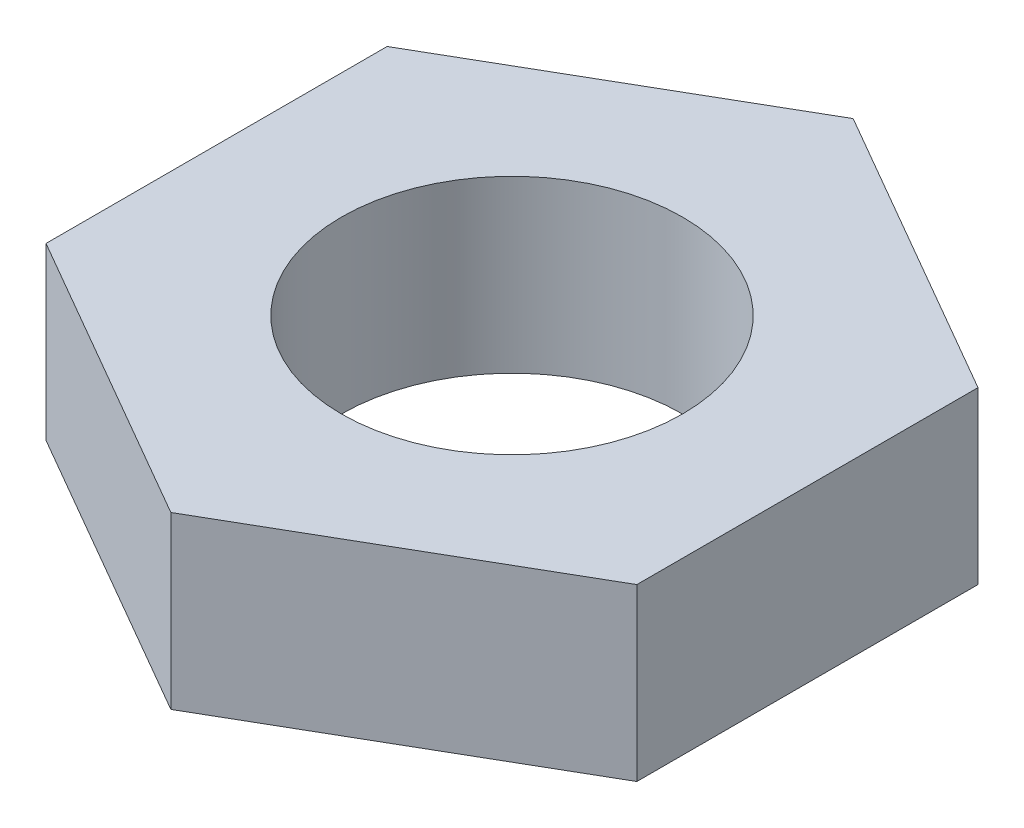
ISO-10303-21;
HEADER;
FILE_DESCRIPTION(('STEP AP214'),'2;1');
FILE_NAME('part.step','',(''),(''),'','','');
FILE_SCHEMA(('AUTOMOTIVE_DESIGN { 1 0 10303 214 1 1 1 1 }'));
ENDSEC;
DATA;
#1=APPLICATION_CONTEXT('core data for automotive mechanical design processes');
#2=APPLICATION_PROTOCOL_DEFINITION('international standard','automotive_design',2000,#1);
#3=PRODUCT_CONTEXT('',#1,'mechanical');
#4=PRODUCT('Part','Part','',(#3));
#5=PRODUCT_RELATED_PRODUCT_CATEGORY('part','',(#4));
#6=PRODUCT_DEFINITION_FORMATION('','',#4);
#7=PRODUCT_DEFINITION_CONTEXT('part definition',#1,'design');
#8=PRODUCT_DEFINITION('design','',#6,#7);
#9=PRODUCT_DEFINITION_SHAPE('','',#8);
#10=(LENGTH_UNIT() NAMED_UNIT(*) SI_UNIT(.MILLI.,.METRE.));
#11=(NAMED_UNIT(*) PLANE_ANGLE_UNIT() SI_UNIT($,.RADIAN.));
#12=(NAMED_UNIT(*) SI_UNIT($,.STERADIAN.) SOLID_ANGLE_UNIT());
#13=UNCERTAINTY_MEASURE_WITH_UNIT(LENGTH_MEASURE(1.E-05),#10,'distance_accuracy_value','');
#14=(GEOMETRIC_REPRESENTATION_CONTEXT(3) GLOBAL_UNCERTAINTY_ASSIGNED_CONTEXT((#13)) GLOBAL_UNIT_ASSIGNED_CONTEXT((#10,
#11,#12)) REPRESENTATION_CONTEXT('',''));
#15=CARTESIAN_POINT('',(0.,0.,0.));
#16=DIRECTION('',(0.,0.,1.));
#17=DIRECTION('',(1.,0.,0.));
#18=AXIS2_PLACEMENT_3D('',#15,#16,#17);
#19=CARTESIAN_POINT('',(0.866025403784438,1.,-1.5));
#20=DIRECTION('',(-0.5,0.,0.866025403784439));
#21=DIRECTION('',(0.866025403784439,0.,0.5));
#22=AXIS2_PLACEMENT_3D('',#19,#20,#21);
#23=PLANE('',#22);
#24=DIRECTION('',(-0.866025403784439,0.,-0.5));
#25=VECTOR('',#24,1.);
#26=CARTESIAN_POINT('',(0.866025403784438,0.,-1.5));
#27=LINE('',#26,#25);
#28=CARTESIAN_POINT('',(1.73205080756888,0.,-1.));
#29=VERTEX_POINT('',#28);
#30=CARTESIAN_POINT('',(0.,0.,-2.));
#31=VERTEX_POINT('',#30);
#32=EDGE_CURVE('E130',#29,#31,#27,.T.);
#33=ORIENTED_EDGE('',*,*,#32,.T.);
#34=DIRECTION('',(0.,-1.,0.));
#35=VECTOR('',#34,1.);
#36=CARTESIAN_POINT('',(0.,1.,-2.));
#37=LINE('',#36,#35);
#38=CARTESIAN_POINT('',(0.,1.,-2.));
#39=VERTEX_POINT('',#38);
#40=EDGE_CURVE('E11',#39,#31,#37,.T.);
#41=ORIENTED_EDGE('',*,*,#40,.F.);
#42=DIRECTION('',(-0.866025403784439,0.,-0.5));
#43=VECTOR('',#42,1.);
#44=CARTESIAN_POINT('',(0.866025403784438,1.,-1.5));
#45=LINE('',#44,#43);
#46=CARTESIAN_POINT('',(1.73205080756888,1.,-1.));
#47=VERTEX_POINT('',#46);
#48=EDGE_CURVE('E143',#47,#39,#45,.T.);
#49=ORIENTED_EDGE('',*,*,#48,.F.);
#50=DIRECTION('',(0.,-1.,0.));
#51=VECTOR('',#50,1.);
#52=CARTESIAN_POINT('',(1.73205080756888,1.,-1.));
#53=LINE('',#52,#51);
#54=EDGE_CURVE('E129',#47,#29,#53,.T.);
#55=ORIENTED_EDGE('',*,*,#54,.T.);
#56=EDGE_LOOP('',(#33,#41,#49,#55));
#57=FACE_BOUND('',#56,.T.);
#58=ADVANCED_FACE('F42',(#57),#23,.F.);
#59=CARTESIAN_POINT('',(-0.866025403784438,1.,-1.5));
#60=DIRECTION('',(0.5,0.,0.866025403784439));
#61=DIRECTION('',(0.866025403784439,0.,-0.5));
#62=AXIS2_PLACEMENT_3D('',#59,#60,#61);
#63=PLANE('',#62);
#64=DIRECTION('',(-0.866025403784439,0.,0.5));
#65=VECTOR('',#64,1.);
#66=CARTESIAN_POINT('',(-0.866025403784438,0.,-1.5));
#67=LINE('',#66,#65);
#68=CARTESIAN_POINT('',(-1.73205080756888,0.,-1.));
#69=VERTEX_POINT('',#68);
#70=EDGE_CURVE('E133',#31,#69,#67,.T.);
#71=ORIENTED_EDGE('',*,*,#70,.T.);
#72=DIRECTION('',(0.,-1.,0.));
#73=VECTOR('',#72,1.);
#74=CARTESIAN_POINT('',(-1.73205080756888,1.,-1.));
#75=LINE('',#74,#73);
#76=CARTESIAN_POINT('',(-1.73205080756888,1.,-1.));
#77=VERTEX_POINT('',#76);
#78=EDGE_CURVE('E50',#77,#69,#75,.T.);
#79=ORIENTED_EDGE('',*,*,#78,.F.);
#80=DIRECTION('',(-0.866025403784439,0.,0.5));
#81=VECTOR('',#80,1.);
#82=CARTESIAN_POINT('',(-0.866025403784438,1.,-1.5));
#83=LINE('',#82,#81);
#84=EDGE_CURVE('E95',#39,#77,#83,.T.);
#85=ORIENTED_EDGE('',*,*,#84,.F.);
#86=ORIENTED_EDGE('',*,*,#40,.T.);
#87=EDGE_LOOP('',(#71,#79,#85,#86));
#88=FACE_BOUND('',#87,.T.);
#89=ADVANCED_FACE('F170',(#88),#63,.F.);
#90=CARTESIAN_POINT('',(-1.73205080756888,1.,0.));
#91=DIRECTION('',(1.,0.,0.));
#92=DIRECTION('',(0.,0.,-1.));
#93=AXIS2_PLACEMENT_3D('',#90,#91,#92);
#94=PLANE('',#93);
#95=DIRECTION('',(0.,0.,1.));
#96=VECTOR('',#95,1.);
#97=CARTESIAN_POINT('',(-1.73205080756888,0.,0.));
#98=LINE('',#97,#96);
#99=CARTESIAN_POINT('',(-1.73205080756888,0.,1.));
#100=VERTEX_POINT('',#99);
#101=EDGE_CURVE('E135',#69,#100,#98,.T.);
#102=ORIENTED_EDGE('',*,*,#101,.T.);
#103=DIRECTION('',(0.,-1.,0.));
#104=VECTOR('',#103,1.);
#105=CARTESIAN_POINT('',(-1.73205080756888,1.,1.));
#106=LINE('',#105,#104);
#107=CARTESIAN_POINT('',(-1.73205080756888,1.,1.));
#108=VERTEX_POINT('',#107);
#109=EDGE_CURVE('E118',#108,#100,#106,.T.);
#110=ORIENTED_EDGE('',*,*,#109,.F.);
#111=DIRECTION('',(0.,0.,1.));
#112=VECTOR('',#111,1.);
#113=CARTESIAN_POINT('',(-1.73205080756888,1.,0.));
#114=LINE('',#113,#112);
#115=EDGE_CURVE('E109',#77,#108,#114,.T.);
#116=ORIENTED_EDGE('',*,*,#115,.F.);
#117=ORIENTED_EDGE('',*,*,#78,.T.);
#118=EDGE_LOOP('',(#102,#110,#116,#117));
#119=FACE_BOUND('',#118,.T.);
#120=ADVANCED_FACE('F149',(#119),#94,.F.);
#121=CARTESIAN_POINT('',(-0.866025403784439,1.,1.5));
#122=DIRECTION('',(0.5,0.,-0.866025403784439));
#123=DIRECTION('',(-0.866025403784439,0.,-0.5));
#124=AXIS2_PLACEMENT_3D('',#121,#122,#123);
#125=PLANE('',#124);
#126=DIRECTION('',(0.866025403784439,0.,0.5));
#127=VECTOR('',#126,1.);
#128=CARTESIAN_POINT('',(-0.866025403784439,0.,1.5));
#129=LINE('',#128,#127);
#130=CARTESIAN_POINT('',(0.,0.,2.));
#131=VERTEX_POINT('',#130);
#132=EDGE_CURVE('E117',#100,#131,#129,.T.);
#133=ORIENTED_EDGE('',*,*,#132,.T.);
#134=DIRECTION('',(0.,-1.,0.));
#135=VECTOR('',#134,1.);
#136=CARTESIAN_POINT('',(0.,1.,2.));
#137=LINE('',#136,#135);
#138=CARTESIAN_POINT('',(0.,1.,2.));
#139=VERTEX_POINT('',#138);
#140=EDGE_CURVE('E114',#139,#131,#137,.T.);
#141=ORIENTED_EDGE('',*,*,#140,.F.);
#142=DIRECTION('',(0.866025403784439,0.,0.5));
#143=VECTOR('',#142,1.);
#144=CARTESIAN_POINT('',(-0.866025403784439,1.,1.5));
#145=LINE('',#144,#143);
#146=EDGE_CURVE('E102',#108,#139,#145,.T.);
#147=ORIENTED_EDGE('',*,*,#146,.F.);
#148=ORIENTED_EDGE('',*,*,#109,.T.);
#149=EDGE_LOOP('',(#133,#141,#147,#148));
#150=FACE_BOUND('',#149,.T.);
#151=ADVANCED_FACE('F115',(#150),#125,.F.);
#152=CARTESIAN_POINT('',(0.866025403784438,1.,1.5));
#153=DIRECTION('',(-0.5,0.,-0.866025403784439));
#154=DIRECTION('',(-0.866025403784439,0.,0.5));
#155=AXIS2_PLACEMENT_3D('',#152,#153,#154);
#156=PLANE('',#155);
#157=DIRECTION('',(0.866025403784439,0.,-0.5));
#158=VECTOR('',#157,1.);
#159=CARTESIAN_POINT('',(0.866025403784438,0.,1.5));
#160=LINE('',#159,#158);
#161=CARTESIAN_POINT('',(1.73205080756888,0.,1.));
#162=VERTEX_POINT('',#161);
#163=EDGE_CURVE('E81',#131,#162,#160,.T.);
#164=ORIENTED_EDGE('',*,*,#163,.T.);
#165=DIRECTION('',(0.,-1.,0.));
#166=VECTOR('',#165,1.);
#167=CARTESIAN_POINT('',(1.73205080756888,1.,1.));
#168=LINE('',#167,#166);
#169=CARTESIAN_POINT('',(1.73205080756888,1.,1.));
#170=VERTEX_POINT('',#169);
#171=EDGE_CURVE('E119',#170,#162,#168,.T.);
#172=ORIENTED_EDGE('',*,*,#171,.F.);
#173=DIRECTION('',(0.866025403784439,0.,-0.5));
#174=VECTOR('',#173,1.);
#175=CARTESIAN_POINT('',(0.866025403784438,1.,1.5));
#176=LINE('',#175,#174);
#177=EDGE_CURVE('E107',#139,#170,#176,.T.);
#178=ORIENTED_EDGE('',*,*,#177,.F.);
#179=ORIENTED_EDGE('',*,*,#140,.T.);
#180=EDGE_LOOP('',(#164,#172,#178,#179));
#181=FACE_BOUND('',#180,.T.);
#182=ADVANCED_FACE('F121',(#181),#156,.F.);
#183=CARTESIAN_POINT('',(1.73205080756888,1.,0.));
#184=DIRECTION('',(-1.,0.,0.));
#185=DIRECTION('',(0.,0.,1.));
#186=AXIS2_PLACEMENT_3D('',#183,#184,#185);
#187=PLANE('',#186);
#188=DIRECTION('',(0.,0.,-1.));
#189=VECTOR('',#188,1.);
#190=CARTESIAN_POINT('',(1.73205080756888,0.,0.));
#191=LINE('',#190,#189);
#192=EDGE_CURVE('E87',#162,#29,#191,.T.);
#193=ORIENTED_EDGE('',*,*,#192,.T.);
#194=ORIENTED_EDGE('',*,*,#54,.F.);
#195=DIRECTION('',(0.,0.,-1.));
#196=VECTOR('',#195,1.);
#197=CARTESIAN_POINT('',(1.73205080756888,1.,0.));
#198=LINE('',#197,#196);
#199=EDGE_CURVE('E58',#170,#47,#198,.T.);
#200=ORIENTED_EDGE('',*,*,#199,.F.);
#201=ORIENTED_EDGE('',*,*,#171,.T.);
#202=EDGE_LOOP('',(#193,#194,#200,#201));
#203=FACE_BOUND('',#202,.T.);
#204=ADVANCED_FACE('F157',(#203),#187,.F.);
#205=CARTESIAN_POINT('',(0.,1.,0.));
#206=DIRECTION('',(0.,-1.,0.));
#207=DIRECTION('',(0.,0.,-1.));
#208=AXIS2_PLACEMENT_3D('',#205,#206,#207);
#209=CYLINDRICAL_SURFACE('',#208,1.);
#210=CARTESIAN_POINT('',(0.,1.,0.));
#211=DIRECTION('',(0.,1.,0.));
#212=DIRECTION('',(0.,0.,1.));
#213=AXIS2_PLACEMENT_3D('',#210,#211,#212);
#214=CIRCLE('',#213,1.);
#215=CARTESIAN_POINT('',(0.,1.,1.));
#216=VERTEX_POINT('',#215);
#217=EDGE_CURVE('E123',#216,#216,#214,.T.);
#218=ORIENTED_EDGE('',*,*,#217,.T.);
#219=EDGE_LOOP('',(#218));
#220=FACE_BOUND('',#219,.T.);
#221=CARTESIAN_POINT('',(0.,0.,0.));
#222=DIRECTION('',(0.,1.,0.));
#223=DIRECTION('',(0.,0.,1.));
#224=AXIS2_PLACEMENT_3D('',#221,#222,#223);
#225=CIRCLE('',#224,1.);
#226=CARTESIAN_POINT('',(0.,0.,1.));
#227=VERTEX_POINT('',#226);
#228=EDGE_CURVE('E140',#227,#227,#225,.T.);
#229=ORIENTED_EDGE('',*,*,#228,.F.);
#230=EDGE_LOOP('',(#229));
#231=FACE_BOUND('',#230,.T.);
#232=ADVANCED_FACE('F159',(#220,#231),#209,.F.);
#233=CARTESIAN_POINT('',(0.,1.,0.));
#234=DIRECTION('',(0.,1.,0.));
#235=DIRECTION('',(0.,0.,1.));
#236=AXIS2_PLACEMENT_3D('',#233,#234,#235);
#237=PLANE('',#236);
#238=ORIENTED_EDGE('',*,*,#48,.T.);
#239=ORIENTED_EDGE('',*,*,#84,.T.);
#240=ORIENTED_EDGE('',*,*,#115,.T.);
#241=ORIENTED_EDGE('',*,*,#146,.T.);
#242=ORIENTED_EDGE('',*,*,#177,.T.);
#243=ORIENTED_EDGE('',*,*,#199,.T.);
#244=EDGE_LOOP('',(#238,#239,#240,#241,#242,#243));
#245=FACE_BOUND('',#244,.T.);
#246=ORIENTED_EDGE('',*,*,#217,.F.);
#247=EDGE_LOOP('',(#246));
#248=FACE_BOUND('',#247,.T.);
#249=ADVANCED_FACE('F104',(#245,#248),#237,.T.);
#250=CARTESIAN_POINT('',(0.,0.,0.));
#251=DIRECTION('',(0.,1.,0.));
#252=DIRECTION('',(0.,0.,1.));
#253=AXIS2_PLACEMENT_3D('',#250,#251,#252);
#254=PLANE('',#253);
#255=ORIENTED_EDGE('',*,*,#32,.F.);
#256=ORIENTED_EDGE('',*,*,#192,.F.);
#257=ORIENTED_EDGE('',*,*,#163,.F.);
#258=ORIENTED_EDGE('',*,*,#132,.F.);
#259=ORIENTED_EDGE('',*,*,#101,.F.);
#260=ORIENTED_EDGE('',*,*,#70,.F.);
#261=EDGE_LOOP('',(#255,#256,#257,#258,#259,#260));
#262=FACE_BOUND('',#261,.T.);
#263=ORIENTED_EDGE('',*,*,#228,.T.);
#264=EDGE_LOOP('',(#263));
#265=FACE_BOUND('',#264,.T.);
#266=ADVANCED_FACE('F152',(#262,#265),#254,.F.);
#267=CLOSED_SHELL('',(#58,#89,#120,#151,#182,#204,#232,#249,#266));
#268=MANIFOLD_SOLID_BREP('B2',#267);
#269=ADVANCED_BREP_SHAPE_REPRESENTATION('',(#18,#268),#14);
#270=SHAPE_DEFINITION_REPRESENTATION(#9,#269);
ENDSEC;
END-ISO-10303-21;
